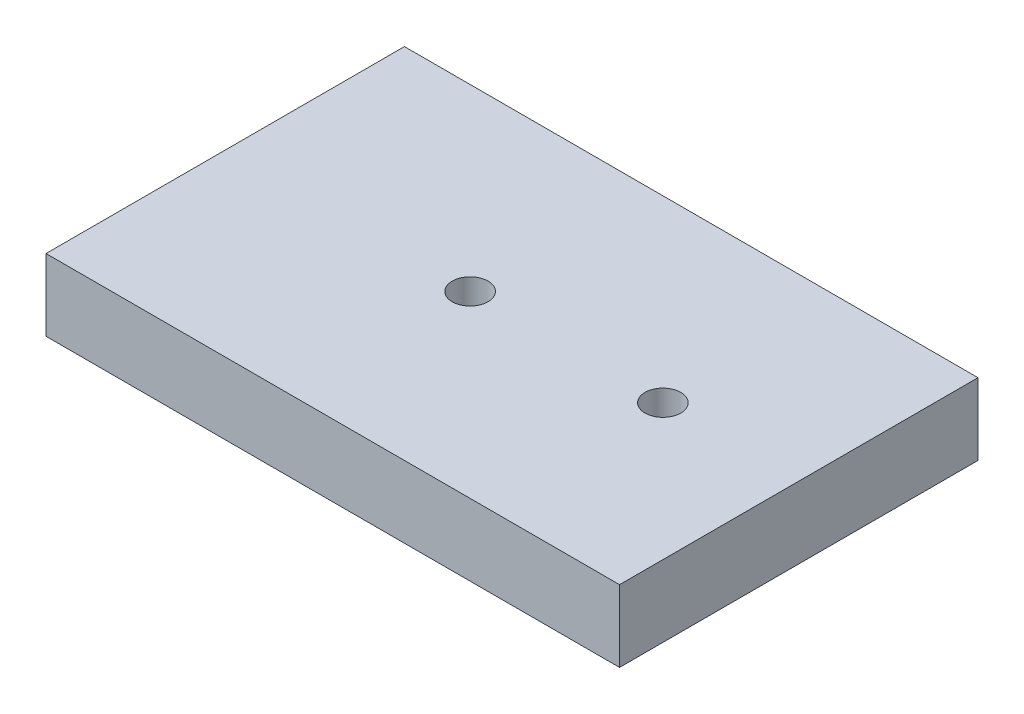
ISO-10303-21;
HEADER;
FILE_DESCRIPTION(('STEP AP214'),'2;1');
FILE_NAME('part.step','',(''),(''),'','','');
FILE_SCHEMA(('AUTOMOTIVE_DESIGN { 1 0 10303 214 1 1 1 1 }'));
ENDSEC;
DATA;
#1=APPLICATION_CONTEXT('core data for automotive mechanical design processes');
#2=APPLICATION_PROTOCOL_DEFINITION('international standard','automotive_design',2000,#1);
#3=PRODUCT_CONTEXT('',#1,'mechanical');
#4=PRODUCT('Part','Part','',(#3));
#5=PRODUCT_RELATED_PRODUCT_CATEGORY('part','',(#4));
#6=PRODUCT_DEFINITION_FORMATION('','',#4);
#7=PRODUCT_DEFINITION_CONTEXT('part definition',#1,'design');
#8=PRODUCT_DEFINITION('design','',#6,#7);
#9=PRODUCT_DEFINITION_SHAPE('','',#8);
#10=(LENGTH_UNIT() NAMED_UNIT(*) SI_UNIT(.MILLI.,.METRE.));
#11=(NAMED_UNIT(*) PLANE_ANGLE_UNIT() SI_UNIT($,.RADIAN.));
#12=(NAMED_UNIT(*) SI_UNIT($,.STERADIAN.) SOLID_ANGLE_UNIT());
#13=UNCERTAINTY_MEASURE_WITH_UNIT(LENGTH_MEASURE(1.E-05),#10,'distance_accuracy_value','');
#14=(GEOMETRIC_REPRESENTATION_CONTEXT(3) GLOBAL_UNCERTAINTY_ASSIGNED_CONTEXT((#13)) GLOBAL_UNIT_ASSIGNED_CONTEXT((#10,
#11,#12)) REPRESENTATION_CONTEXT('',''));
#15=CARTESIAN_POINT('',(0.,0.,0.));
#16=DIRECTION('',(0.,0.,1.));
#17=DIRECTION('',(1.,0.,0.));
#18=AXIS2_PLACEMENT_3D('',#15,#16,#17);
#19=CARTESIAN_POINT('',(80.,20.,-50.));
#20=DIRECTION('',(-1.,0.,0.));
#21=DIRECTION('',(0.,0.,1.));
#22=AXIS2_PLACEMENT_3D('',#19,#20,#21);
#23=PLANE('',#22);
#24=DIRECTION('',(0.,0.,-1.));
#25=VECTOR('',#24,1.);
#26=CARTESIAN_POINT('',(80.,0.,-50.));
#27=LINE('',#26,#25);
#28=CARTESIAN_POINT('',(80.,0.,50.));
#29=VERTEX_POINT('',#28);
#30=CARTESIAN_POINT('',(80.,0.,-50.));
#31=VERTEX_POINT('',#30);
#32=EDGE_CURVE('E104',#29,#31,#27,.T.);
#33=ORIENTED_EDGE('',*,*,#32,.T.);
#34=DIRECTION('',(0.,-1.,0.));
#35=VECTOR('',#34,1.);
#36=CARTESIAN_POINT('',(80.,20.,-50.));
#37=LINE('',#36,#35);
#38=CARTESIAN_POINT('',(80.,20.,-50.));
#39=VERTEX_POINT('',#38);
#40=EDGE_CURVE('E11',#39,#31,#37,.T.);
#41=ORIENTED_EDGE('',*,*,#40,.F.);
#42=DIRECTION('',(0.,0.,-1.));
#43=VECTOR('',#42,1.);
#44=CARTESIAN_POINT('',(80.,20.,-50.));
#45=LINE('',#44,#43);
#46=CARTESIAN_POINT('',(80.,20.,50.));
#47=VERTEX_POINT('',#46);
#48=EDGE_CURVE('E92',#47,#39,#45,.T.);
#49=ORIENTED_EDGE('',*,*,#48,.F.);
#50=DIRECTION('',(0.,-1.,0.));
#51=VECTOR('',#50,1.);
#52=CARTESIAN_POINT('',(80.,20.,50.));
#53=LINE('',#52,#51);
#54=EDGE_CURVE('E100',#47,#29,#53,.T.);
#55=ORIENTED_EDGE('',*,*,#54,.T.);
#56=EDGE_LOOP('',(#33,#41,#49,#55));
#57=FACE_BOUND('',#56,.T.);
#58=ADVANCED_FACE('F41',(#57),#23,.F.);
#59=CARTESIAN_POINT('',(-80.,20.,-50.));
#60=DIRECTION('',(0.,0.,1.));
#61=DIRECTION('',(1.,0.,0.));
#62=AXIS2_PLACEMENT_3D('',#59,#60,#61);
#63=PLANE('',#62);
#64=DIRECTION('',(-1.,0.,0.));
#65=VECTOR('',#64,1.);
#66=CARTESIAN_POINT('',(-80.,0.,-50.));
#67=LINE('',#66,#65);
#68=CARTESIAN_POINT('',(-80.,0.,-50.));
#69=VERTEX_POINT('',#68);
#70=EDGE_CURVE('E96',#31,#69,#67,.T.);
#71=ORIENTED_EDGE('',*,*,#70,.T.);
#72=DIRECTION('',(0.,-1.,0.));
#73=VECTOR('',#72,1.);
#74=CARTESIAN_POINT('',(-80.,20.,-50.));
#75=LINE('',#74,#73);
#76=CARTESIAN_POINT('',(-80.,20.,-50.));
#77=VERTEX_POINT('',#76);
#78=EDGE_CURVE('E49',#77,#69,#75,.T.);
#79=ORIENTED_EDGE('',*,*,#78,.F.);
#80=DIRECTION('',(-1.,0.,0.));
#81=VECTOR('',#80,1.);
#82=CARTESIAN_POINT('',(-80.,20.,-50.));
#83=LINE('',#82,#81);
#84=EDGE_CURVE('E87',#39,#77,#83,.T.);
#85=ORIENTED_EDGE('',*,*,#84,.F.);
#86=ORIENTED_EDGE('',*,*,#40,.T.);
#87=EDGE_LOOP('',(#71,#79,#85,#86));
#88=FACE_BOUND('',#87,.T.);
#89=ADVANCED_FACE('F95',(#88),#63,.F.);
#90=CARTESIAN_POINT('',(-80.,20.,-50.));
#91=DIRECTION('',(1.,0.,0.));
#92=DIRECTION('',(0.,0.,-1.));
#93=AXIS2_PLACEMENT_3D('',#90,#91,#92);
#94=PLANE('',#93);
#95=DIRECTION('',(0.,0.,1.));
#96=VECTOR('',#95,1.);
#97=CARTESIAN_POINT('',(-80.,0.,-50.));
#98=LINE('',#97,#96);
#99=CARTESIAN_POINT('',(-80.,0.,50.));
#100=VERTEX_POINT('',#99);
#101=EDGE_CURVE('E74',#69,#100,#98,.T.);
#102=ORIENTED_EDGE('',*,*,#101,.T.);
#103=DIRECTION('',(0.,-1.,0.));
#104=VECTOR('',#103,1.);
#105=CARTESIAN_POINT('',(-80.,20.,50.));
#106=LINE('',#105,#104);
#107=CARTESIAN_POINT('',(-80.,20.,50.));
#108=VERTEX_POINT('',#107);
#109=EDGE_CURVE('E97',#108,#100,#106,.T.);
#110=ORIENTED_EDGE('',*,*,#109,.F.);
#111=DIRECTION('',(0.,0.,1.));
#112=VECTOR('',#111,1.);
#113=CARTESIAN_POINT('',(-80.,20.,-50.));
#114=LINE('',#113,#112);
#115=EDGE_CURVE('E90',#77,#108,#114,.T.);
#116=ORIENTED_EDGE('',*,*,#115,.F.);
#117=ORIENTED_EDGE('',*,*,#78,.T.);
#118=EDGE_LOOP('',(#102,#110,#116,#117));
#119=FACE_BOUND('',#118,.T.);
#120=ADVANCED_FACE('F98',(#119),#94,.F.);
#121=CARTESIAN_POINT('',(-80.,20.,50.));
#122=DIRECTION('',(0.,0.,-1.));
#123=DIRECTION('',(-1.,0.,0.));
#124=AXIS2_PLACEMENT_3D('',#121,#122,#123);
#125=PLANE('',#124);
#126=DIRECTION('',(1.,0.,0.));
#127=VECTOR('',#126,1.);
#128=CARTESIAN_POINT('',(-80.,0.,50.));
#129=LINE('',#128,#127);
#130=EDGE_CURVE('E80',#100,#29,#129,.T.);
#131=ORIENTED_EDGE('',*,*,#130,.T.);
#132=ORIENTED_EDGE('',*,*,#54,.F.);
#133=DIRECTION('',(1.,0.,0.));
#134=VECTOR('',#133,1.);
#135=CARTESIAN_POINT('',(-80.,20.,50.));
#136=LINE('',#135,#134);
#137=EDGE_CURVE('E57',#108,#47,#136,.T.);
#138=ORIENTED_EDGE('',*,*,#137,.F.);
#139=ORIENTED_EDGE('',*,*,#109,.T.);
#140=EDGE_LOOP('',(#131,#132,#138,#139));
#141=FACE_BOUND('',#140,.T.);
#142=ADVANCED_FACE('F112',(#141),#125,.F.);
#143=CARTESIAN_POINT('',(0.,20.,0.));
#144=DIRECTION('',(0.,1.,0.));
#145=DIRECTION('',(0.,0.,1.));
#146=AXIS2_PLACEMENT_3D('',#143,#144,#145);
#147=PLANE('',#146);
#148=CARTESIAN_POINT('',(-11.6856217379551,20.,0.));
#149=DIRECTION('',(0.,1.,0.));
#150=DIRECTION('',(0.,0.,1.));
#151=AXIS2_PLACEMENT_3D('',#148,#149,#150);
#152=CIRCLE('',#151,5.);
#153=CARTESIAN_POINT('',(-11.6856217379551,20.,5.));
#154=VERTEX_POINT('',#153);
#155=EDGE_CURVE('E124',#154,#154,#152,.T.);
#156=ORIENTED_EDGE('',*,*,#155,.F.);
#157=EDGE_LOOP('',(#156));
#158=FACE_BOUND('',#157,.T.);
#159=CARTESIAN_POINT('',(42.0943782620449,20.,0.));
#160=DIRECTION('',(0.,1.,0.));
#161=DIRECTION('',(0.,0.,1.));
#162=AXIS2_PLACEMENT_3D('',#159,#160,#161);
#163=CIRCLE('',#162,5.);
#164=CARTESIAN_POINT('',(42.0943782620449,20.,5.));
#165=VERTEX_POINT('',#164);
#166=EDGE_CURVE('E121',#165,#165,#163,.T.);
#167=ORIENTED_EDGE('',*,*,#166,.F.);
#168=EDGE_LOOP('',(#167));
#169=FACE_BOUND('',#168,.T.);
#170=ORIENTED_EDGE('',*,*,#48,.T.);
#171=ORIENTED_EDGE('',*,*,#84,.T.);
#172=ORIENTED_EDGE('',*,*,#115,.T.);
#173=ORIENTED_EDGE('',*,*,#137,.T.);
#174=EDGE_LOOP('',(#170,#171,#172,#173));
#175=FACE_BOUND('',#174,.T.);
#176=ADVANCED_FACE('F88',(#158,#169,#175),#147,.T.);
#177=CARTESIAN_POINT('',(0.,0.,0.));
#178=DIRECTION('',(0.,1.,0.));
#179=DIRECTION('',(0.,0.,1.));
#180=AXIS2_PLACEMENT_3D('',#177,#178,#179);
#181=PLANE('',#180);
#182=ORIENTED_EDGE('',*,*,#32,.F.);
#183=ORIENTED_EDGE('',*,*,#130,.F.);
#184=ORIENTED_EDGE('',*,*,#101,.F.);
#185=ORIENTED_EDGE('',*,*,#70,.F.);
#186=EDGE_LOOP('',(#182,#183,#184,#185));
#187=FACE_BOUND('',#186,.T.);
#188=ADVANCED_FACE('F115',(#187),#181,.F.);
#189=CARTESIAN_POINT('',(42.0943782620449,10.2,0.));
#190=DIRECTION('',(0.,1.,0.));
#191=DIRECTION('',(0.,0.,1.));
#192=AXIS2_PLACEMENT_3D('',#189,#190,#191);
#193=CYLINDRICAL_SURFACE('',#192,5.);
#194=CARTESIAN_POINT('',(42.0943782620449,10.2,0.));
#195=DIRECTION('',(0.,1.,0.));
#196=DIRECTION('',(0.,0.,1.));
#197=AXIS2_PLACEMENT_3D('',#194,#195,#196);
#198=CIRCLE('',#197,5.);
#199=CARTESIAN_POINT('',(42.0943782620449,10.2,5.));
#200=VERTEX_POINT('',#199);
#201=EDGE_CURVE('E118',#200,#200,#198,.T.);
#202=ORIENTED_EDGE('',*,*,#201,.F.);
#203=EDGE_LOOP('',(#202));
#204=FACE_BOUND('',#203,.T.);
#205=ORIENTED_EDGE('',*,*,#166,.T.);
#206=EDGE_LOOP('',(#205));
#207=FACE_BOUND('',#206,.T.);
#208=ADVANCED_FACE('F144',(#204,#207),#193,.F.);
#209=CARTESIAN_POINT('',(42.0943782620449,10.2,0.));
#210=DIRECTION('',(0.,1.,0.));
#211=DIRECTION('',(0.,0.,1.));
#212=AXIS2_PLACEMENT_3D('',#209,#210,#211);
#213=PLANE('',#212);
#214=ORIENTED_EDGE('',*,*,#201,.T.);
#215=EDGE_LOOP('',(#214));
#216=FACE_BOUND('',#215,.T.);
#217=ADVANCED_FACE('F135',(#216),#213,.T.);
#218=CARTESIAN_POINT('',(-11.6856217379551,10.2,0.));
#219=DIRECTION('',(0.,1.,0.));
#220=DIRECTION('',(0.,0.,1.));
#221=AXIS2_PLACEMENT_3D('',#218,#219,#220);
#222=CYLINDRICAL_SURFACE('',#221,5.);
#223=CARTESIAN_POINT('',(-11.6856217379551,10.2,0.));
#224=DIRECTION('',(0.,1.,0.));
#225=DIRECTION('',(0.,0.,1.));
#226=AXIS2_PLACEMENT_3D('',#223,#224,#225);
#227=CIRCLE('',#226,5.);
#228=CARTESIAN_POINT('',(-11.6856217379551,10.2,5.));
#229=VERTEX_POINT('',#228);
#230=EDGE_CURVE('E107',#229,#229,#227,.T.);
#231=ORIENTED_EDGE('',*,*,#230,.F.);
#232=EDGE_LOOP('',(#231));
#233=FACE_BOUND('',#232,.T.);
#234=ORIENTED_EDGE('',*,*,#155,.T.);
#235=EDGE_LOOP('',(#234));
#236=FACE_BOUND('',#235,.T.);
#237=ADVANCED_FACE('F132',(#233,#236),#222,.F.);
#238=CARTESIAN_POINT('',(-11.6856217379551,10.2,0.));
#239=DIRECTION('',(0.,1.,0.));
#240=DIRECTION('',(0.,0.,1.));
#241=AXIS2_PLACEMENT_3D('',#238,#239,#240);
#242=PLANE('',#241);
#243=ORIENTED_EDGE('',*,*,#230,.T.);
#244=EDGE_LOOP('',(#243));
#245=FACE_BOUND('',#244,.T.);
#246=ADVANCED_FACE('F130',(#245),#242,.T.);
#247=CLOSED_SHELL('',(#58,#89,#120,#142,#176,#188,#208,#217,#237,#246));
#248=MANIFOLD_SOLID_BREP('B2',#247);
#249=ADVANCED_BREP_SHAPE_REPRESENTATION('',(#18,#248),#14);
#250=SHAPE_DEFINITION_REPRESENTATION(#9,#249);
ENDSEC;
END-ISO-10303-21;
